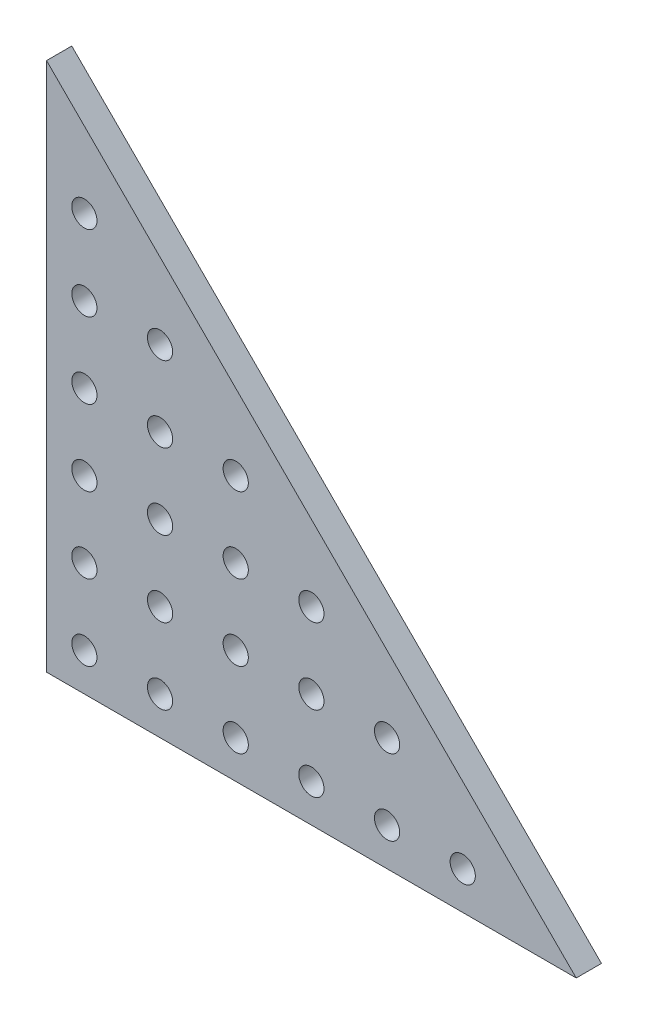
ISO-10303-21;
HEADER;
FILE_DESCRIPTION(('STEP AP214'),'2;1');
FILE_NAME('part.step','',(''),(''),'','','');
FILE_SCHEMA(('AUTOMOTIVE_DESIGN { 1 0 10303 214 1 1 1 1 }'));
ENDSEC;
DATA;
#1=APPLICATION_CONTEXT('core data for automotive mechanical design processes');
#2=APPLICATION_PROTOCOL_DEFINITION('international standard','automotive_design',2000,#1);
#3=PRODUCT_CONTEXT('',#1,'mechanical');
#4=PRODUCT('Part','Part','',(#3));
#5=PRODUCT_RELATED_PRODUCT_CATEGORY('part','',(#4));
#6=PRODUCT_DEFINITION_FORMATION('','',#4);
#7=PRODUCT_DEFINITION_CONTEXT('part definition',#1,'design');
#8=PRODUCT_DEFINITION('design','',#6,#7);
#9=PRODUCT_DEFINITION_SHAPE('','',#8);
#10=(LENGTH_UNIT() NAMED_UNIT(*) SI_UNIT(.MILLI.,.METRE.));
#11=(NAMED_UNIT(*) PLANE_ANGLE_UNIT() SI_UNIT($,.RADIAN.));
#12=(NAMED_UNIT(*) SI_UNIT($,.STERADIAN.) SOLID_ANGLE_UNIT());
#13=UNCERTAINTY_MEASURE_WITH_UNIT(LENGTH_MEASURE(1.E-05),#10,'distance_accuracy_value','');
#14=(GEOMETRIC_REPRESENTATION_CONTEXT(3) GLOBAL_UNCERTAINTY_ASSIGNED_CONTEXT((#13)) GLOBAL_UNIT_ASSIGNED_CONTEXT((#10,
#11,#12)) REPRESENTATION_CONTEXT('',''));
#15=CARTESIAN_POINT('',(0.,0.,0.));
#16=DIRECTION('',(0.,0.,1.));
#17=DIRECTION('',(1.,0.,0.));
#18=AXIS2_PLACEMENT_3D('',#15,#16,#17);
#19=CARTESIAN_POINT('',(0.,0.,3.));
#20=DIRECTION('',(0.,0.,1.));
#21=DIRECTION('',(1.,0.,0.));
#22=AXIS2_PLACEMENT_3D('',#19,#20,#21);
#23=PLANE('',#22);
#24=CARTESIAN_POINT('',(-65.443383637,47.056539338,3.));
#25=DIRECTION('',(0.,0.,1.));
#26=DIRECTION('',(1.,0.,0.));
#27=AXIS2_PLACEMENT_3D('',#24,#25,#26);
#28=CIRCLE('',#27,1.5);
#29=CARTESIAN_POINT('',(-63.943383637,47.056539338,3.));
#30=VERTEX_POINT('',#29);
#31=EDGE_CURVE('E148',#30,#30,#28,.T.);
#32=ORIENTED_EDGE('',*,*,#31,.F.);
#33=EDGE_LOOP('',(#32));
#34=FACE_BOUND('',#33,.T.);
#35=CARTESIAN_POINT('',(-83.443383637,47.056539338,3.));
#36=DIRECTION('',(0.,0.,1.));
#37=DIRECTION('',(1.,0.,0.));
#38=AXIS2_PLACEMENT_3D('',#35,#36,#37);
#39=CIRCLE('',#38,1.5);
#40=CARTESIAN_POINT('',(-81.943383637,47.056539338,3.));
#41=VERTEX_POINT('',#40);
#42=EDGE_CURVE('E158',#41,#41,#39,.T.);
#43=ORIENTED_EDGE('',*,*,#42,.F.);
#44=EDGE_LOOP('',(#43));
#45=FACE_BOUND('',#44,.T.);
#46=CARTESIAN_POINT('',(-101.443383637,47.056539338,3.));
#47=DIRECTION('',(0.,0.,1.));
#48=DIRECTION('',(1.,0.,0.));
#49=AXIS2_PLACEMENT_3D('',#46,#47,#48);
#50=CIRCLE('',#49,1.5);
#51=CARTESIAN_POINT('',(-99.943383637,47.056539338,3.));
#52=VERTEX_POINT('',#51);
#53=EDGE_CURVE('E168',#52,#52,#50,.T.);
#54=ORIENTED_EDGE('',*,*,#53,.F.);
#55=EDGE_LOOP('',(#54));
#56=FACE_BOUND('',#55,.T.);
#57=CARTESIAN_POINT('',(-74.443383637,56.056539338,3.));
#58=DIRECTION('',(0.,0.,1.));
#59=DIRECTION('',(1.,0.,0.));
#60=AXIS2_PLACEMENT_3D('',#57,#58,#59);
#61=CIRCLE('',#60,1.5);
#62=CARTESIAN_POINT('',(-72.943383637,56.056539338,3.));
#63=VERTEX_POINT('',#62);
#64=EDGE_CURVE('E178',#63,#63,#61,.T.);
#65=ORIENTED_EDGE('',*,*,#64,.F.);
#66=EDGE_LOOP('',(#65));
#67=FACE_BOUND('',#66,.T.);
#68=CARTESIAN_POINT('',(-92.443383637,56.056539338,3.));
#69=DIRECTION('',(0.,0.,1.));
#70=DIRECTION('',(1.,0.,0.));
#71=AXIS2_PLACEMENT_3D('',#68,#69,#70);
#72=CIRCLE('',#71,1.5);
#73=CARTESIAN_POINT('',(-90.943383637,56.056539338,3.));
#74=VERTEX_POINT('',#73);
#75=EDGE_CURVE('E188',#74,#74,#72,.T.);
#76=ORIENTED_EDGE('',*,*,#75,.F.);
#77=EDGE_LOOP('',(#76));
#78=FACE_BOUND('',#77,.T.);
#79=CARTESIAN_POINT('',(-74.443383637,65.056539338,3.));
#80=DIRECTION('',(0.,0.,1.));
#81=DIRECTION('',(1.,0.,0.));
#82=AXIS2_PLACEMENT_3D('',#79,#80,#81);
#83=CIRCLE('',#82,1.5);
#84=CARTESIAN_POINT('',(-72.943383637,65.056539338,3.));
#85=VERTEX_POINT('',#84);
#86=EDGE_CURVE('E198',#85,#85,#83,.T.);
#87=ORIENTED_EDGE('',*,*,#86,.F.);
#88=EDGE_LOOP('',(#87));
#89=FACE_BOUND('',#88,.T.);
#90=CARTESIAN_POINT('',(-92.443383637,65.056539338,3.));
#91=DIRECTION('',(0.,0.,1.));
#92=DIRECTION('',(1.,0.,0.));
#93=AXIS2_PLACEMENT_3D('',#90,#91,#92);
#94=CIRCLE('',#93,1.5);
#95=CARTESIAN_POINT('',(-90.943383637,65.056539338,3.));
#96=VERTEX_POINT('',#95);
#97=EDGE_CURVE('E208',#96,#96,#94,.T.);
#98=ORIENTED_EDGE('',*,*,#97,.F.);
#99=EDGE_LOOP('',(#98));
#100=FACE_BOUND('',#99,.T.);
#101=CARTESIAN_POINT('',(-83.443383637,74.056539338,3.));
#102=DIRECTION('',(0.,0.,1.));
#103=DIRECTION('',(1.,0.,0.));
#104=AXIS2_PLACEMENT_3D('',#101,#102,#103);
#105=CIRCLE('',#104,1.5);
#106=CARTESIAN_POINT('',(-81.943383637,74.056539338,3.));
#107=VERTEX_POINT('',#106);
#108=EDGE_CURVE('E218',#107,#107,#105,.T.);
#109=ORIENTED_EDGE('',*,*,#108,.F.);
#110=EDGE_LOOP('',(#109));
#111=FACE_BOUND('',#110,.T.);
#112=CARTESIAN_POINT('',(-101.443383637,74.056539338,3.));
#113=DIRECTION('',(0.,0.,1.));
#114=DIRECTION('',(1.,0.,0.));
#115=AXIS2_PLACEMENT_3D('',#112,#113,#114);
#116=CIRCLE('',#115,1.5);
#117=CARTESIAN_POINT('',(-99.943383637,74.056539338,3.));
#118=VERTEX_POINT('',#117);
#119=EDGE_CURVE('E228',#118,#118,#116,.T.);
#120=ORIENTED_EDGE('',*,*,#119,.F.);
#121=EDGE_LOOP('',(#120));
#122=FACE_BOUND('',#121,.T.);
#123=CARTESIAN_POINT('',(-101.443383637,83.056539338,3.));
#124=DIRECTION('',(0.,0.,1.));
#125=DIRECTION('',(1.,0.,0.));
#126=AXIS2_PLACEMENT_3D('',#123,#124,#125);
#127=CIRCLE('',#126,1.5);
#128=CARTESIAN_POINT('',(-99.943383637,83.056539338,3.));
#129=VERTEX_POINT('',#128);
#130=EDGE_CURVE('E238',#129,#129,#127,.T.);
#131=ORIENTED_EDGE('',*,*,#130,.F.);
#132=EDGE_LOOP('',(#131));
#133=FACE_BOUND('',#132,.T.);
#134=DIRECTION('',(-0.707106781186547,0.707106781186547,0.));
#135=VECTOR('',#134,1.);
#136=CARTESIAN_POINT('',(-105.943383637,105.556539338,3.));
#137=LINE('',#136,#135);
#138=CARTESIAN_POINT('',(-42.943383637,42.556539338,3.));
#139=VERTEX_POINT('',#138);
#140=CARTESIAN_POINT('',(-105.943383637,105.556539338,3.));
#141=VERTEX_POINT('',#140);
#142=EDGE_CURVE('E74',#139,#141,#137,.T.);
#143=ORIENTED_EDGE('',*,*,#142,.T.);
#144=DIRECTION('',(0.,-1.,0.));
#145=VECTOR('',#144,1.);
#146=CARTESIAN_POINT('',(-105.943383637,105.556539338,3.));
#147=LINE('',#146,#145);
#148=CARTESIAN_POINT('',(-105.943383637,42.556539338,3.));
#149=VERTEX_POINT('',#148);
#150=EDGE_CURVE('E70',#141,#149,#147,.T.);
#151=ORIENTED_EDGE('',*,*,#150,.T.);
#152=DIRECTION('',(1.,0.,0.));
#153=VECTOR('',#152,1.);
#154=CARTESIAN_POINT('',(-105.943383637,42.556539338,3.));
#155=LINE('',#154,#153);
#156=EDGE_CURVE('E50',#149,#139,#155,.T.);
#157=ORIENTED_EDGE('',*,*,#156,.T.);
#158=EDGE_LOOP('',(#143,#151,#157));
#159=FACE_BOUND('',#158,.T.);
#160=CARTESIAN_POINT('',(-101.443383637,92.056539338,3.));
#161=DIRECTION('',(0.,0.,1.));
#162=DIRECTION('',(1.,0.,0.));
#163=AXIS2_PLACEMENT_3D('',#160,#161,#162);
#164=CIRCLE('',#163,1.5);
#165=CARTESIAN_POINT('',(-99.943383637,92.056539338,3.));
#166=VERTEX_POINT('',#165);
#167=EDGE_CURVE('E84',#166,#166,#164,.T.);
#168=ORIENTED_EDGE('',*,*,#167,.F.);
#169=EDGE_LOOP('',(#168));
#170=FACE_BOUND('',#169,.T.);
#171=CARTESIAN_POINT('',(-92.443383637,83.056539338,3.));
#172=DIRECTION('',(0.,0.,1.));
#173=DIRECTION('',(1.,0.,0.));
#174=AXIS2_PLACEMENT_3D('',#171,#172,#173);
#175=CIRCLE('',#174,1.5);
#176=CARTESIAN_POINT('',(-90.943383637,83.056539338,3.));
#177=VERTEX_POINT('',#176);
#178=EDGE_CURVE('E233',#177,#177,#175,.T.);
#179=ORIENTED_EDGE('',*,*,#178,.F.);
#180=EDGE_LOOP('',(#179));
#181=FACE_BOUND('',#180,.T.);
#182=CARTESIAN_POINT('',(-92.443383637,74.056539338,3.));
#183=DIRECTION('',(0.,0.,1.));
#184=DIRECTION('',(1.,0.,0.));
#185=AXIS2_PLACEMENT_3D('',#182,#183,#184);
#186=CIRCLE('',#185,1.5);
#187=CARTESIAN_POINT('',(-90.943383637,74.056539338,3.));
#188=VERTEX_POINT('',#187);
#189=EDGE_CURVE('E223',#188,#188,#186,.T.);
#190=ORIENTED_EDGE('',*,*,#189,.F.);
#191=EDGE_LOOP('',(#190));
#192=FACE_BOUND('',#191,.T.);
#193=CARTESIAN_POINT('',(-101.443383637,65.056539338,3.));
#194=DIRECTION('',(0.,0.,1.));
#195=DIRECTION('',(1.,0.,0.));
#196=AXIS2_PLACEMENT_3D('',#193,#194,#195);
#197=CIRCLE('',#196,1.5);
#198=CARTESIAN_POINT('',(-99.943383637,65.056539338,3.));
#199=VERTEX_POINT('',#198);
#200=EDGE_CURVE('E213',#199,#199,#197,.T.);
#201=ORIENTED_EDGE('',*,*,#200,.F.);
#202=EDGE_LOOP('',(#201));
#203=FACE_BOUND('',#202,.T.);
#204=CARTESIAN_POINT('',(-83.443383637,65.056539338,3.));
#205=DIRECTION('',(0.,0.,1.));
#206=DIRECTION('',(1.,0.,0.));
#207=AXIS2_PLACEMENT_3D('',#204,#205,#206);
#208=CIRCLE('',#207,1.5);
#209=CARTESIAN_POINT('',(-81.943383637,65.056539338,3.));
#210=VERTEX_POINT('',#209);
#211=EDGE_CURVE('E203',#210,#210,#208,.T.);
#212=ORIENTED_EDGE('',*,*,#211,.F.);
#213=EDGE_LOOP('',(#212));
#214=FACE_BOUND('',#213,.T.);
#215=CARTESIAN_POINT('',(-101.443383637,56.056539338,3.));
#216=DIRECTION('',(0.,0.,1.));
#217=DIRECTION('',(1.,0.,0.));
#218=AXIS2_PLACEMENT_3D('',#215,#216,#217);
#219=CIRCLE('',#218,1.5);
#220=CARTESIAN_POINT('',(-99.943383637,56.056539338,3.));
#221=VERTEX_POINT('',#220);
#222=EDGE_CURVE('E193',#221,#221,#219,.T.);
#223=ORIENTED_EDGE('',*,*,#222,.F.);
#224=EDGE_LOOP('',(#223));
#225=FACE_BOUND('',#224,.T.);
#226=CARTESIAN_POINT('',(-83.443383637,56.056539338,3.));
#227=DIRECTION('',(0.,0.,1.));
#228=DIRECTION('',(1.,0.,0.));
#229=AXIS2_PLACEMENT_3D('',#226,#227,#228);
#230=CIRCLE('',#229,1.5);
#231=CARTESIAN_POINT('',(-81.943383637,56.056539338,3.));
#232=VERTEX_POINT('',#231);
#233=EDGE_CURVE('E183',#232,#232,#230,.T.);
#234=ORIENTED_EDGE('',*,*,#233,.F.);
#235=EDGE_LOOP('',(#234));
#236=FACE_BOUND('',#235,.T.);
#237=CARTESIAN_POINT('',(-65.443383637,56.056539338,3.));
#238=DIRECTION('',(0.,0.,1.));
#239=DIRECTION('',(1.,0.,0.));
#240=AXIS2_PLACEMENT_3D('',#237,#238,#239);
#241=CIRCLE('',#240,1.5);
#242=CARTESIAN_POINT('',(-63.943383637,56.056539338,3.));
#243=VERTEX_POINT('',#242);
#244=EDGE_CURVE('E173',#243,#243,#241,.T.);
#245=ORIENTED_EDGE('',*,*,#244,.F.);
#246=EDGE_LOOP('',(#245));
#247=FACE_BOUND('',#246,.T.);
#248=CARTESIAN_POINT('',(-92.443383637,47.056539338,3.));
#249=DIRECTION('',(0.,0.,1.));
#250=DIRECTION('',(1.,0.,0.));
#251=AXIS2_PLACEMENT_3D('',#248,#249,#250);
#252=CIRCLE('',#251,1.5);
#253=CARTESIAN_POINT('',(-90.943383637,47.056539338,3.));
#254=VERTEX_POINT('',#253);
#255=EDGE_CURVE('E163',#254,#254,#252,.T.);
#256=ORIENTED_EDGE('',*,*,#255,.F.);
#257=EDGE_LOOP('',(#256));
#258=FACE_BOUND('',#257,.T.);
#259=CARTESIAN_POINT('',(-74.443383637,47.056539338,3.));
#260=DIRECTION('',(0.,0.,1.));
#261=DIRECTION('',(1.,0.,0.));
#262=AXIS2_PLACEMENT_3D('',#259,#260,#261);
#263=CIRCLE('',#262,1.5);
#264=CARTESIAN_POINT('',(-72.943383637,47.056539338,3.));
#265=VERTEX_POINT('',#264);
#266=EDGE_CURVE('E153',#265,#265,#263,.T.);
#267=ORIENTED_EDGE('',*,*,#266,.F.);
#268=EDGE_LOOP('',(#267));
#269=FACE_BOUND('',#268,.T.);
#270=CARTESIAN_POINT('',(-56.443383637,47.056539338,3.));
#271=DIRECTION('',(0.,0.,1.));
#272=DIRECTION('',(1.,0.,0.));
#273=AXIS2_PLACEMENT_3D('',#270,#271,#272);
#274=CIRCLE('',#273,1.5);
#275=CARTESIAN_POINT('',(-54.943383637,47.056539338,3.));
#276=VERTEX_POINT('',#275);
#277=EDGE_CURVE('E142',#276,#276,#274,.T.);
#278=ORIENTED_EDGE('',*,*,#277,.F.);
#279=EDGE_LOOP('',(#278));
#280=FACE_BOUND('',#279,.T.);
#281=ADVANCED_FACE('F33',(#34,#45,#56,#67,#78,#89,#100,#111,#122,#133,#159,#170,#181,#192,#203,
#214,#225,#236,#247,#258,#269,#280),#23,.T.);
#282=CARTESIAN_POINT('',(0.,0.,0.));
#283=DIRECTION('',(0.,0.,1.));
#284=DIRECTION('',(1.,0.,0.));
#285=AXIS2_PLACEMENT_3D('',#282,#283,#284);
#286=PLANE('',#285);
#287=CARTESIAN_POINT('',(-65.443383637,47.056539338,0.));
#288=DIRECTION('',(0.,0.,1.));
#289=DIRECTION('',(1.,0.,0.));
#290=AXIS2_PLACEMENT_3D('',#287,#288,#289);
#291=CIRCLE('',#290,1.5);
#292=CARTESIAN_POINT('',(-63.943383637,47.056539338,0.));
#293=VERTEX_POINT('',#292);
#294=EDGE_CURVE('E145',#293,#293,#291,.T.);
#295=ORIENTED_EDGE('',*,*,#294,.T.);
#296=EDGE_LOOP('',(#295));
#297=FACE_BOUND('',#296,.T.);
#298=CARTESIAN_POINT('',(-83.443383637,47.056539338,0.));
#299=DIRECTION('',(0.,0.,1.));
#300=DIRECTION('',(1.,0.,0.));
#301=AXIS2_PLACEMENT_3D('',#298,#299,#300);
#302=CIRCLE('',#301,1.5);
#303=CARTESIAN_POINT('',(-81.943383637,47.056539338,0.));
#304=VERTEX_POINT('',#303);
#305=EDGE_CURVE('E156',#304,#304,#302,.T.);
#306=ORIENTED_EDGE('',*,*,#305,.T.);
#307=EDGE_LOOP('',(#306));
#308=FACE_BOUND('',#307,.T.);
#309=CARTESIAN_POINT('',(-101.443383637,47.056539338,0.));
#310=DIRECTION('',(0.,0.,1.));
#311=DIRECTION('',(1.,0.,0.));
#312=AXIS2_PLACEMENT_3D('',#309,#310,#311);
#313=CIRCLE('',#312,1.5);
#314=CARTESIAN_POINT('',(-99.943383637,47.056539338,0.));
#315=VERTEX_POINT('',#314);
#316=EDGE_CURVE('E166',#315,#315,#313,.T.);
#317=ORIENTED_EDGE('',*,*,#316,.T.);
#318=EDGE_LOOP('',(#317));
#319=FACE_BOUND('',#318,.T.);
#320=CARTESIAN_POINT('',(-74.443383637,56.056539338,0.));
#321=DIRECTION('',(0.,0.,1.));
#322=DIRECTION('',(1.,0.,0.));
#323=AXIS2_PLACEMENT_3D('',#320,#321,#322);
#324=CIRCLE('',#323,1.5);
#325=CARTESIAN_POINT('',(-72.943383637,56.056539338,0.));
#326=VERTEX_POINT('',#325);
#327=EDGE_CURVE('E176',#326,#326,#324,.T.);
#328=ORIENTED_EDGE('',*,*,#327,.T.);
#329=EDGE_LOOP('',(#328));
#330=FACE_BOUND('',#329,.T.);
#331=CARTESIAN_POINT('',(-92.443383637,56.056539338,0.));
#332=DIRECTION('',(0.,0.,1.));
#333=DIRECTION('',(1.,0.,0.));
#334=AXIS2_PLACEMENT_3D('',#331,#332,#333);
#335=CIRCLE('',#334,1.5);
#336=CARTESIAN_POINT('',(-90.943383637,56.056539338,0.));
#337=VERTEX_POINT('',#336);
#338=EDGE_CURVE('E186',#337,#337,#335,.T.);
#339=ORIENTED_EDGE('',*,*,#338,.T.);
#340=EDGE_LOOP('',(#339));
#341=FACE_BOUND('',#340,.T.);
#342=CARTESIAN_POINT('',(-74.443383637,65.056539338,0.));
#343=DIRECTION('',(0.,0.,1.));
#344=DIRECTION('',(1.,0.,0.));
#345=AXIS2_PLACEMENT_3D('',#342,#343,#344);
#346=CIRCLE('',#345,1.5);
#347=CARTESIAN_POINT('',(-72.943383637,65.056539338,0.));
#348=VERTEX_POINT('',#347);
#349=EDGE_CURVE('E196',#348,#348,#346,.T.);
#350=ORIENTED_EDGE('',*,*,#349,.T.);
#351=EDGE_LOOP('',(#350));
#352=FACE_BOUND('',#351,.T.);
#353=CARTESIAN_POINT('',(-92.443383637,65.056539338,0.));
#354=DIRECTION('',(0.,0.,1.));
#355=DIRECTION('',(1.,0.,0.));
#356=AXIS2_PLACEMENT_3D('',#353,#354,#355);
#357=CIRCLE('',#356,1.5);
#358=CARTESIAN_POINT('',(-90.943383637,65.056539338,0.));
#359=VERTEX_POINT('',#358);
#360=EDGE_CURVE('E206',#359,#359,#357,.T.);
#361=ORIENTED_EDGE('',*,*,#360,.T.);
#362=EDGE_LOOP('',(#361));
#363=FACE_BOUND('',#362,.T.);
#364=CARTESIAN_POINT('',(-83.443383637,74.056539338,0.));
#365=DIRECTION('',(0.,0.,1.));
#366=DIRECTION('',(1.,0.,0.));
#367=AXIS2_PLACEMENT_3D('',#364,#365,#366);
#368=CIRCLE('',#367,1.5);
#369=CARTESIAN_POINT('',(-81.943383637,74.056539338,0.));
#370=VERTEX_POINT('',#369);
#371=EDGE_CURVE('E216',#370,#370,#368,.T.);
#372=ORIENTED_EDGE('',*,*,#371,.T.);
#373=EDGE_LOOP('',(#372));
#374=FACE_BOUND('',#373,.T.);
#375=CARTESIAN_POINT('',(-101.443383637,74.056539338,0.));
#376=DIRECTION('',(0.,0.,1.));
#377=DIRECTION('',(1.,0.,0.));
#378=AXIS2_PLACEMENT_3D('',#375,#376,#377);
#379=CIRCLE('',#378,1.5);
#380=CARTESIAN_POINT('',(-99.943383637,74.056539338,0.));
#381=VERTEX_POINT('',#380);
#382=EDGE_CURVE('E226',#381,#381,#379,.T.);
#383=ORIENTED_EDGE('',*,*,#382,.T.);
#384=EDGE_LOOP('',(#383));
#385=FACE_BOUND('',#384,.T.);
#386=CARTESIAN_POINT('',(-101.443383637,83.056539338,0.));
#387=DIRECTION('',(0.,0.,1.));
#388=DIRECTION('',(1.,0.,0.));
#389=AXIS2_PLACEMENT_3D('',#386,#387,#388);
#390=CIRCLE('',#389,1.5);
#391=CARTESIAN_POINT('',(-99.943383637,83.056539338,0.));
#392=VERTEX_POINT('',#391);
#393=EDGE_CURVE('E236',#392,#392,#390,.T.);
#394=ORIENTED_EDGE('',*,*,#393,.T.);
#395=EDGE_LOOP('',(#394));
#396=FACE_BOUND('',#395,.T.);
#397=DIRECTION('',(-0.707106781186547,0.707106781186547,0.));
#398=VECTOR('',#397,1.);
#399=CARTESIAN_POINT('',(-105.943383637,105.556539338,0.));
#400=LINE('',#399,#398);
#401=CARTESIAN_POINT('',(-42.943383637,42.556539338,0.));
#402=VERTEX_POINT('',#401);
#403=CARTESIAN_POINT('',(-105.943383637,105.556539338,0.));
#404=VERTEX_POINT('',#403);
#405=EDGE_CURVE('E81',#402,#404,#400,.T.);
#406=ORIENTED_EDGE('',*,*,#405,.F.);
#407=DIRECTION('',(1.,0.,0.));
#408=VECTOR('',#407,1.);
#409=CARTESIAN_POINT('',(-105.943383637,42.556539338,0.));
#410=LINE('',#409,#408);
#411=CARTESIAN_POINT('',(-105.943383637,42.556539338,0.));
#412=VERTEX_POINT('',#411);
#413=EDGE_CURVE('E67',#412,#402,#410,.T.);
#414=ORIENTED_EDGE('',*,*,#413,.F.);
#415=DIRECTION('',(0.,-1.,0.));
#416=VECTOR('',#415,1.);
#417=CARTESIAN_POINT('',(-105.943383637,105.556539338,0.));
#418=LINE('',#417,#416);
#419=EDGE_CURVE('E62',#404,#412,#418,.T.);
#420=ORIENTED_EDGE('',*,*,#419,.F.);
#421=EDGE_LOOP('',(#406,#414,#420));
#422=FACE_BOUND('',#421,.T.);
#423=CARTESIAN_POINT('',(-101.443383637,92.056539338,0.));
#424=DIRECTION('',(0.,0.,1.));
#425=DIRECTION('',(1.,0.,0.));
#426=AXIS2_PLACEMENT_3D('',#423,#424,#425);
#427=CIRCLE('',#426,1.5);
#428=CARTESIAN_POINT('',(-99.943383637,92.056539338,0.));
#429=VERTEX_POINT('',#428);
#430=EDGE_CURVE('E88',#429,#429,#427,.T.);
#431=ORIENTED_EDGE('',*,*,#430,.T.);
#432=EDGE_LOOP('',(#431));
#433=FACE_BOUND('',#432,.T.);
#434=CARTESIAN_POINT('',(-92.443383637,83.056539338,0.));
#435=DIRECTION('',(0.,0.,1.));
#436=DIRECTION('',(1.,0.,0.));
#437=AXIS2_PLACEMENT_3D('',#434,#435,#436);
#438=CIRCLE('',#437,1.5);
#439=CARTESIAN_POINT('',(-90.943383637,83.056539338,0.));
#440=VERTEX_POINT('',#439);
#441=EDGE_CURVE('E105',#440,#440,#438,.T.);
#442=ORIENTED_EDGE('',*,*,#441,.T.);
#443=EDGE_LOOP('',(#442));
#444=FACE_BOUND('',#443,.T.);
#445=CARTESIAN_POINT('',(-92.443383637,74.056539338,0.));
#446=DIRECTION('',(0.,0.,1.));
#447=DIRECTION('',(1.,0.,0.));
#448=AXIS2_PLACEMENT_3D('',#445,#446,#447);
#449=CIRCLE('',#448,1.5);
#450=CARTESIAN_POINT('',(-90.943383637,74.056539338,0.));
#451=VERTEX_POINT('',#450);
#452=EDGE_CURVE('E109',#451,#451,#449,.T.);
#453=ORIENTED_EDGE('',*,*,#452,.T.);
#454=EDGE_LOOP('',(#453));
#455=FACE_BOUND('',#454,.T.);
#456=CARTESIAN_POINT('',(-101.443383637,65.056539338,0.));
#457=DIRECTION('',(0.,0.,1.));
#458=DIRECTION('',(1.,0.,0.));
#459=AXIS2_PLACEMENT_3D('',#456,#457,#458);
#460=CIRCLE('',#459,1.5);
#461=CARTESIAN_POINT('',(-99.943383637,65.056539338,0.));
#462=VERTEX_POINT('',#461);
#463=EDGE_CURVE('E113',#462,#462,#460,.T.);
#464=ORIENTED_EDGE('',*,*,#463,.T.);
#465=EDGE_LOOP('',(#464));
#466=FACE_BOUND('',#465,.T.);
#467=CARTESIAN_POINT('',(-83.443383637,65.056539338,0.));
#468=DIRECTION('',(0.,0.,1.));
#469=DIRECTION('',(1.,0.,0.));
#470=AXIS2_PLACEMENT_3D('',#467,#468,#469);
#471=CIRCLE('',#470,1.5);
#472=CARTESIAN_POINT('',(-81.943383637,65.056539338,0.));
#473=VERTEX_POINT('',#472);
#474=EDGE_CURVE('E117',#473,#473,#471,.T.);
#475=ORIENTED_EDGE('',*,*,#474,.T.);
#476=EDGE_LOOP('',(#475));
#477=FACE_BOUND('',#476,.T.);
#478=CARTESIAN_POINT('',(-101.443383637,56.056539338,0.));
#479=DIRECTION('',(0.,0.,1.));
#480=DIRECTION('',(1.,0.,0.));
#481=AXIS2_PLACEMENT_3D('',#478,#479,#480);
#482=CIRCLE('',#481,1.5);
#483=CARTESIAN_POINT('',(-99.943383637,56.056539338,0.));
#484=VERTEX_POINT('',#483);
#485=EDGE_CURVE('E121',#484,#484,#482,.T.);
#486=ORIENTED_EDGE('',*,*,#485,.T.);
#487=EDGE_LOOP('',(#486));
#488=FACE_BOUND('',#487,.T.);
#489=CARTESIAN_POINT('',(-83.443383637,56.056539338,0.));
#490=DIRECTION('',(0.,0.,1.));
#491=DIRECTION('',(1.,0.,0.));
#492=AXIS2_PLACEMENT_3D('',#489,#490,#491);
#493=CIRCLE('',#492,1.5);
#494=CARTESIAN_POINT('',(-81.943383637,56.056539338,0.));
#495=VERTEX_POINT('',#494);
#496=EDGE_CURVE('E125',#495,#495,#493,.T.);
#497=ORIENTED_EDGE('',*,*,#496,.T.);
#498=EDGE_LOOP('',(#497));
#499=FACE_BOUND('',#498,.T.);
#500=CARTESIAN_POINT('',(-65.443383637,56.056539338,0.));
#501=DIRECTION('',(0.,0.,1.));
#502=DIRECTION('',(1.,0.,0.));
#503=AXIS2_PLACEMENT_3D('',#500,#501,#502);
#504=CIRCLE('',#503,1.5);
#505=CARTESIAN_POINT('',(-63.943383637,56.056539338,0.));
#506=VERTEX_POINT('',#505);
#507=EDGE_CURVE('E129',#506,#506,#504,.T.);
#508=ORIENTED_EDGE('',*,*,#507,.T.);
#509=EDGE_LOOP('',(#508));
#510=FACE_BOUND('',#509,.T.);
#511=CARTESIAN_POINT('',(-92.443383637,47.056539338,0.));
#512=DIRECTION('',(0.,0.,1.));
#513=DIRECTION('',(1.,0.,0.));
#514=AXIS2_PLACEMENT_3D('',#511,#512,#513);
#515=CIRCLE('',#514,1.5);
#516=CARTESIAN_POINT('',(-90.943383637,47.056539338,0.));
#517=VERTEX_POINT('',#516);
#518=EDGE_CURVE('E133',#517,#517,#515,.T.);
#519=ORIENTED_EDGE('',*,*,#518,.T.);
#520=EDGE_LOOP('',(#519));
#521=FACE_BOUND('',#520,.T.);
#522=CARTESIAN_POINT('',(-74.443383637,47.056539338,0.));
#523=DIRECTION('',(0.,0.,1.));
#524=DIRECTION('',(1.,0.,0.));
#525=AXIS2_PLACEMENT_3D('',#522,#523,#524);
#526=CIRCLE('',#525,1.5);
#527=CARTESIAN_POINT('',(-72.943383637,47.056539338,0.));
#528=VERTEX_POINT('',#527);
#529=EDGE_CURVE('E137',#528,#528,#526,.T.);
#530=ORIENTED_EDGE('',*,*,#529,.T.);
#531=EDGE_LOOP('',(#530));
#532=FACE_BOUND('',#531,.T.);
#533=CARTESIAN_POINT('',(-56.443383637,47.056539338,0.));
#534=DIRECTION('',(0.,0.,1.));
#535=DIRECTION('',(1.,0.,0.));
#536=AXIS2_PLACEMENT_3D('',#533,#534,#535);
#537=CIRCLE('',#536,1.5);
#538=CARTESIAN_POINT('',(-54.943383637,47.056539338,0.));
#539=VERTEX_POINT('',#538);
#540=EDGE_CURVE('E140',#539,#539,#537,.T.);
#541=ORIENTED_EDGE('',*,*,#540,.T.);
#542=EDGE_LOOP('',(#541));
#543=FACE_BOUND('',#542,.T.);
#544=ADVANCED_FACE('F94',(#297,#308,#319,#330,#341,#352,#363,#374,#385,#396,#422,#433,#444,#455,
#466,#477,#488,#499,#510,#521,#532,#543),#286,.F.);
#545=CARTESIAN_POINT('',(-105.943383637,105.556539338,3.));
#546=DIRECTION('',(-0.707106781186548,-0.707106781186548,0.));
#547=DIRECTION('',(0.707106781186548,-0.707106781186548,0.));
#548=AXIS2_PLACEMENT_3D('',#545,#546,#547);
#549=PLANE('',#548);
#550=ORIENTED_EDGE('',*,*,#405,.T.);
#551=DIRECTION('',(0.,0.,-1.));
#552=VECTOR('',#551,1.);
#553=CARTESIAN_POINT('',(-105.943383637,105.556539338,3.));
#554=LINE('',#553,#552);
#555=EDGE_CURVE('E11',#141,#404,#554,.T.);
#556=ORIENTED_EDGE('',*,*,#555,.F.);
#557=ORIENTED_EDGE('',*,*,#142,.F.);
#558=DIRECTION('',(0.,0.,-1.));
#559=VECTOR('',#558,1.);
#560=CARTESIAN_POINT('',(-42.943383637,42.556539338,3.));
#561=LINE('',#560,#559);
#562=EDGE_CURVE('E82',#139,#402,#561,.T.);
#563=ORIENTED_EDGE('',*,*,#562,.T.);
#564=EDGE_LOOP('',(#550,#556,#557,#563));
#565=FACE_BOUND('',#564,.T.);
#566=ADVANCED_FACE('F35',(#565),#549,.F.);
#567=CARTESIAN_POINT('',(-105.943383637,105.556539338,3.));
#568=DIRECTION('',(1.,0.,0.));
#569=DIRECTION('',(0.,0.,-1.));
#570=AXIS2_PLACEMENT_3D('',#567,#568,#569);
#571=PLANE('',#570);
#572=ORIENTED_EDGE('',*,*,#419,.T.);
#573=DIRECTION('',(0.,0.,-1.));
#574=VECTOR('',#573,1.);
#575=CARTESIAN_POINT('',(-105.943383637,42.556539338,3.));
#576=LINE('',#575,#574);
#577=EDGE_CURVE('E42',#149,#412,#576,.T.);
#578=ORIENTED_EDGE('',*,*,#577,.F.);
#579=ORIENTED_EDGE('',*,*,#150,.F.);
#580=ORIENTED_EDGE('',*,*,#555,.T.);
#581=EDGE_LOOP('',(#572,#578,#579,#580));
#582=FACE_BOUND('',#581,.T.);
#583=ADVANCED_FACE('F71',(#582),#571,.F.);
#584=CARTESIAN_POINT('',(-105.943383637,42.556539338,3.));
#585=DIRECTION('',(0.,1.,0.));
#586=DIRECTION('',(0.,0.,1.));
#587=AXIS2_PLACEMENT_3D('',#584,#585,#586);
#588=PLANE('',#587);
#589=ORIENTED_EDGE('',*,*,#413,.T.);
#590=ORIENTED_EDGE('',*,*,#562,.F.);
#591=ORIENTED_EDGE('',*,*,#156,.F.);
#592=ORIENTED_EDGE('',*,*,#577,.T.);
#593=EDGE_LOOP('',(#589,#590,#591,#592));
#594=FACE_BOUND('',#593,.T.);
#595=ADVANCED_FACE('F93',(#594),#588,.F.);
#596=CARTESIAN_POINT('',(-101.443383637,92.056539338,3.));
#597=DIRECTION('',(0.,0.,-1.));
#598=DIRECTION('',(-1.,0.,0.));
#599=AXIS2_PLACEMENT_3D('',#596,#597,#598);
#600=CYLINDRICAL_SURFACE('',#599,1.5);
#601=ORIENTED_EDGE('',*,*,#167,.T.);
#602=EDGE_LOOP('',(#601));
#603=FACE_BOUND('',#602,.T.);
#604=ORIENTED_EDGE('',*,*,#430,.F.);
#605=EDGE_LOOP('',(#604));
#606=FACE_BOUND('',#605,.T.);
#607=ADVANCED_FACE('F249',(#603,#606),#600,.F.);
#608=CARTESIAN_POINT('',(-101.443383637,83.056539338,3.));
#609=DIRECTION('',(0.,0.,-1.));
#610=DIRECTION('',(-1.,0.,0.));
#611=AXIS2_PLACEMENT_3D('',#608,#609,#610);
#612=CYLINDRICAL_SURFACE('',#611,1.5);
#613=ORIENTED_EDGE('',*,*,#130,.T.);
#614=EDGE_LOOP('',(#613));
#615=FACE_BOUND('',#614,.T.);
#616=ORIENTED_EDGE('',*,*,#393,.F.);
#617=EDGE_LOOP('',(#616));
#618=FACE_BOUND('',#617,.T.);
#619=ADVANCED_FACE('F246',(#615,#618),#612,.F.);
#620=CARTESIAN_POINT('',(-92.443383637,83.056539338,3.));
#621=DIRECTION('',(0.,0.,-1.));
#622=DIRECTION('',(-1.,0.,0.));
#623=AXIS2_PLACEMENT_3D('',#620,#621,#622);
#624=CYLINDRICAL_SURFACE('',#623,1.5);
#625=ORIENTED_EDGE('',*,*,#178,.T.);
#626=EDGE_LOOP('',(#625));
#627=FACE_BOUND('',#626,.T.);
#628=ORIENTED_EDGE('',*,*,#441,.F.);
#629=EDGE_LOOP('',(#628));
#630=FACE_BOUND('',#629,.T.);
#631=ADVANCED_FACE('F248',(#627,#630),#624,.F.);
#632=CARTESIAN_POINT('',(-101.443383637,74.056539338,3.));
#633=DIRECTION('',(0.,0.,-1.));
#634=DIRECTION('',(-1.,0.,0.));
#635=AXIS2_PLACEMENT_3D('',#632,#633,#634);
#636=CYLINDRICAL_SURFACE('',#635,1.5);
#637=ORIENTED_EDGE('',*,*,#119,.T.);
#638=EDGE_LOOP('',(#637));
#639=FACE_BOUND('',#638,.T.);
#640=ORIENTED_EDGE('',*,*,#382,.F.);
#641=EDGE_LOOP('',(#640));
#642=FACE_BOUND('',#641,.T.);
#643=ADVANCED_FACE('F256',(#639,#642),#636,.F.);
#644=CARTESIAN_POINT('',(-92.443383637,74.056539338,3.));
#645=DIRECTION('',(0.,0.,-1.));
#646=DIRECTION('',(-1.,0.,0.));
#647=AXIS2_PLACEMENT_3D('',#644,#645,#646);
#648=CYLINDRICAL_SURFACE('',#647,1.5);
#649=ORIENTED_EDGE('',*,*,#189,.T.);
#650=EDGE_LOOP('',(#649));
#651=FACE_BOUND('',#650,.T.);
#652=ORIENTED_EDGE('',*,*,#452,.F.);
#653=EDGE_LOOP('',(#652));
#654=FACE_BOUND('',#653,.T.);
#655=ADVANCED_FACE('F319',(#651,#654),#648,.F.);
#656=CARTESIAN_POINT('',(-83.443383637,74.056539338,3.));
#657=DIRECTION('',(0.,0.,-1.));
#658=DIRECTION('',(-1.,0.,0.));
#659=AXIS2_PLACEMENT_3D('',#656,#657,#658);
#660=CYLINDRICAL_SURFACE('',#659,1.5);
#661=ORIENTED_EDGE('',*,*,#108,.T.);
#662=EDGE_LOOP('',(#661));
#663=FACE_BOUND('',#662,.T.);
#664=ORIENTED_EDGE('',*,*,#371,.F.);
#665=EDGE_LOOP('',(#664));
#666=FACE_BOUND('',#665,.T.);
#667=ADVANCED_FACE('F328',(#663,#666),#660,.F.);
#668=CARTESIAN_POINT('',(-101.443383637,65.056539338,3.));
#669=DIRECTION('',(0.,0.,-1.));
#670=DIRECTION('',(-1.,0.,0.));
#671=AXIS2_PLACEMENT_3D('',#668,#669,#670);
#672=CYLINDRICAL_SURFACE('',#671,1.5);
#673=ORIENTED_EDGE('',*,*,#200,.T.);
#674=EDGE_LOOP('',(#673));
#675=FACE_BOUND('',#674,.T.);
#676=ORIENTED_EDGE('',*,*,#463,.F.);
#677=EDGE_LOOP('',(#676));
#678=FACE_BOUND('',#677,.T.);
#679=ADVANCED_FACE('F337',(#675,#678),#672,.F.);
#680=CARTESIAN_POINT('',(-92.443383637,65.056539338,3.));
#681=DIRECTION('',(0.,0.,-1.));
#682=DIRECTION('',(-1.,0.,0.));
#683=AXIS2_PLACEMENT_3D('',#680,#681,#682);
#684=CYLINDRICAL_SURFACE('',#683,1.5);
#685=ORIENTED_EDGE('',*,*,#97,.T.);
#686=EDGE_LOOP('',(#685));
#687=FACE_BOUND('',#686,.T.);
#688=ORIENTED_EDGE('',*,*,#360,.F.);
#689=EDGE_LOOP('',(#688));
#690=FACE_BOUND('',#689,.T.);
#691=ADVANCED_FACE('F346',(#687,#690),#684,.F.);
#692=CARTESIAN_POINT('',(-83.443383637,65.056539338,3.));
#693=DIRECTION('',(0.,0.,-1.));
#694=DIRECTION('',(-1.,0.,0.));
#695=AXIS2_PLACEMENT_3D('',#692,#693,#694);
#696=CYLINDRICAL_SURFACE('',#695,1.5);
#697=ORIENTED_EDGE('',*,*,#211,.T.);
#698=EDGE_LOOP('',(#697));
#699=FACE_BOUND('',#698,.T.);
#700=ORIENTED_EDGE('',*,*,#474,.F.);
#701=EDGE_LOOP('',(#700));
#702=FACE_BOUND('',#701,.T.);
#703=ADVANCED_FACE('F355',(#699,#702),#696,.F.);
#704=CARTESIAN_POINT('',(-74.443383637,65.056539338,3.));
#705=DIRECTION('',(0.,0.,-1.));
#706=DIRECTION('',(-1.,0.,0.));
#707=AXIS2_PLACEMENT_3D('',#704,#705,#706);
#708=CYLINDRICAL_SURFACE('',#707,1.5);
#709=ORIENTED_EDGE('',*,*,#86,.T.);
#710=EDGE_LOOP('',(#709));
#711=FACE_BOUND('',#710,.T.);
#712=ORIENTED_EDGE('',*,*,#349,.F.);
#713=EDGE_LOOP('',(#712));
#714=FACE_BOUND('',#713,.T.);
#715=ADVANCED_FACE('F364',(#711,#714),#708,.F.);
#716=CARTESIAN_POINT('',(-101.443383637,56.056539338,3.));
#717=DIRECTION('',(0.,0.,-1.));
#718=DIRECTION('',(-1.,0.,0.));
#719=AXIS2_PLACEMENT_3D('',#716,#717,#718);
#720=CYLINDRICAL_SURFACE('',#719,1.5);
#721=ORIENTED_EDGE('',*,*,#222,.T.);
#722=EDGE_LOOP('',(#721));
#723=FACE_BOUND('',#722,.T.);
#724=ORIENTED_EDGE('',*,*,#485,.F.);
#725=EDGE_LOOP('',(#724));
#726=FACE_BOUND('',#725,.T.);
#727=ADVANCED_FACE('F373',(#723,#726),#720,.F.);
#728=CARTESIAN_POINT('',(-92.443383637,56.056539338,3.));
#729=DIRECTION('',(0.,0.,-1.));
#730=DIRECTION('',(-1.,0.,0.));
#731=AXIS2_PLACEMENT_3D('',#728,#729,#730);
#732=CYLINDRICAL_SURFACE('',#731,1.5);
#733=ORIENTED_EDGE('',*,*,#75,.T.);
#734=EDGE_LOOP('',(#733));
#735=FACE_BOUND('',#734,.T.);
#736=ORIENTED_EDGE('',*,*,#338,.F.);
#737=EDGE_LOOP('',(#736));
#738=FACE_BOUND('',#737,.T.);
#739=ADVANCED_FACE('F382',(#735,#738),#732,.F.);
#740=CARTESIAN_POINT('',(-83.443383637,56.056539338,3.));
#741=DIRECTION('',(0.,0.,-1.));
#742=DIRECTION('',(-1.,0.,0.));
#743=AXIS2_PLACEMENT_3D('',#740,#741,#742);
#744=CYLINDRICAL_SURFACE('',#743,1.5);
#745=ORIENTED_EDGE('',*,*,#233,.T.);
#746=EDGE_LOOP('',(#745));
#747=FACE_BOUND('',#746,.T.);
#748=ORIENTED_EDGE('',*,*,#496,.F.);
#749=EDGE_LOOP('',(#748));
#750=FACE_BOUND('',#749,.T.);
#751=ADVANCED_FACE('F391',(#747,#750),#744,.F.);
#752=CARTESIAN_POINT('',(-74.443383637,56.056539338,3.));
#753=DIRECTION('',(0.,0.,-1.));
#754=DIRECTION('',(-1.,0.,0.));
#755=AXIS2_PLACEMENT_3D('',#752,#753,#754);
#756=CYLINDRICAL_SURFACE('',#755,1.5);
#757=ORIENTED_EDGE('',*,*,#64,.T.);
#758=EDGE_LOOP('',(#757));
#759=FACE_BOUND('',#758,.T.);
#760=ORIENTED_EDGE('',*,*,#327,.F.);
#761=EDGE_LOOP('',(#760));
#762=FACE_BOUND('',#761,.T.);
#763=ADVANCED_FACE('F400',(#759,#762),#756,.F.);
#764=CARTESIAN_POINT('',(-65.443383637,56.056539338,3.));
#765=DIRECTION('',(0.,0.,-1.));
#766=DIRECTION('',(-1.,0.,0.));
#767=AXIS2_PLACEMENT_3D('',#764,#765,#766);
#768=CYLINDRICAL_SURFACE('',#767,1.5);
#769=ORIENTED_EDGE('',*,*,#244,.T.);
#770=EDGE_LOOP('',(#769));
#771=FACE_BOUND('',#770,.T.);
#772=ORIENTED_EDGE('',*,*,#507,.F.);
#773=EDGE_LOOP('',(#772));
#774=FACE_BOUND('',#773,.T.);
#775=ADVANCED_FACE('F409',(#771,#774),#768,.F.);
#776=CARTESIAN_POINT('',(-101.443383637,47.056539338,3.));
#777=DIRECTION('',(0.,0.,-1.));
#778=DIRECTION('',(-1.,0.,0.));
#779=AXIS2_PLACEMENT_3D('',#776,#777,#778);
#780=CYLINDRICAL_SURFACE('',#779,1.5);
#781=ORIENTED_EDGE('',*,*,#53,.T.);
#782=EDGE_LOOP('',(#781));
#783=FACE_BOUND('',#782,.T.);
#784=ORIENTED_EDGE('',*,*,#316,.F.);
#785=EDGE_LOOP('',(#784));
#786=FACE_BOUND('',#785,.T.);
#787=ADVANCED_FACE('F418',(#783,#786),#780,.F.);
#788=CARTESIAN_POINT('',(-92.443383637,47.056539338,3.));
#789=DIRECTION('',(0.,0.,-1.));
#790=DIRECTION('',(-1.,0.,0.));
#791=AXIS2_PLACEMENT_3D('',#788,#789,#790);
#792=CYLINDRICAL_SURFACE('',#791,1.5);
#793=ORIENTED_EDGE('',*,*,#255,.T.);
#794=EDGE_LOOP('',(#793));
#795=FACE_BOUND('',#794,.T.);
#796=ORIENTED_EDGE('',*,*,#518,.F.);
#797=EDGE_LOOP('',(#796));
#798=FACE_BOUND('',#797,.T.);
#799=ADVANCED_FACE('F427',(#795,#798),#792,.F.);
#800=CARTESIAN_POINT('',(-83.443383637,47.056539338,3.));
#801=DIRECTION('',(0.,0.,-1.));
#802=DIRECTION('',(-1.,0.,0.));
#803=AXIS2_PLACEMENT_3D('',#800,#801,#802);
#804=CYLINDRICAL_SURFACE('',#803,1.5);
#805=ORIENTED_EDGE('',*,*,#42,.T.);
#806=EDGE_LOOP('',(#805));
#807=FACE_BOUND('',#806,.T.);
#808=ORIENTED_EDGE('',*,*,#305,.F.);
#809=EDGE_LOOP('',(#808));
#810=FACE_BOUND('',#809,.T.);
#811=ADVANCED_FACE('F436',(#807,#810),#804,.F.);
#812=CARTESIAN_POINT('',(-74.443383637,47.056539338,3.));
#813=DIRECTION('',(0.,0.,-1.));
#814=DIRECTION('',(-1.,0.,0.));
#815=AXIS2_PLACEMENT_3D('',#812,#813,#814);
#816=CYLINDRICAL_SURFACE('',#815,1.5);
#817=ORIENTED_EDGE('',*,*,#266,.T.);
#818=EDGE_LOOP('',(#817));
#819=FACE_BOUND('',#818,.T.);
#820=ORIENTED_EDGE('',*,*,#529,.F.);
#821=EDGE_LOOP('',(#820));
#822=FACE_BOUND('',#821,.T.);
#823=ADVANCED_FACE('F445',(#819,#822),#816,.F.);
#824=CARTESIAN_POINT('',(-65.443383637,47.056539338,3.));
#825=DIRECTION('',(0.,0.,-1.));
#826=DIRECTION('',(-1.,0.,0.));
#827=AXIS2_PLACEMENT_3D('',#824,#825,#826);
#828=CYLINDRICAL_SURFACE('',#827,1.5);
#829=ORIENTED_EDGE('',*,*,#31,.T.);
#830=EDGE_LOOP('',(#829));
#831=FACE_BOUND('',#830,.T.);
#832=ORIENTED_EDGE('',*,*,#294,.F.);
#833=EDGE_LOOP('',(#832));
#834=FACE_BOUND('',#833,.T.);
#835=ADVANCED_FACE('F454',(#831,#834),#828,.F.);
#836=CARTESIAN_POINT('',(-56.443383637,47.056539338,3.));
#837=DIRECTION('',(0.,0.,-1.));
#838=DIRECTION('',(-1.,0.,0.));
#839=AXIS2_PLACEMENT_3D('',#836,#837,#838);
#840=CYLINDRICAL_SURFACE('',#839,1.5);
#841=ORIENTED_EDGE('',*,*,#277,.T.);
#842=EDGE_LOOP('',(#841));
#843=FACE_BOUND('',#842,.T.);
#844=ORIENTED_EDGE('',*,*,#540,.F.);
#845=EDGE_LOOP('',(#844));
#846=FACE_BOUND('',#845,.T.);
#847=ADVANCED_FACE('F463',(#843,#846),#840,.F.);
#848=CLOSED_SHELL('',(#281,#544,#566,#583,#595,#607,#619,#631,#643,#655,#667,#679,#691,#703,
#715,#727,#739,#751,#763,#775,#787,#799,#811,#823,#835,#847));
#849=MANIFOLD_SOLID_BREP('B2',#848);
#850=ADVANCED_BREP_SHAPE_REPRESENTATION('',(#18,#849),#14);
#851=SHAPE_DEFINITION_REPRESENTATION(#9,#850);
ENDSEC;
END-ISO-10303-21;
